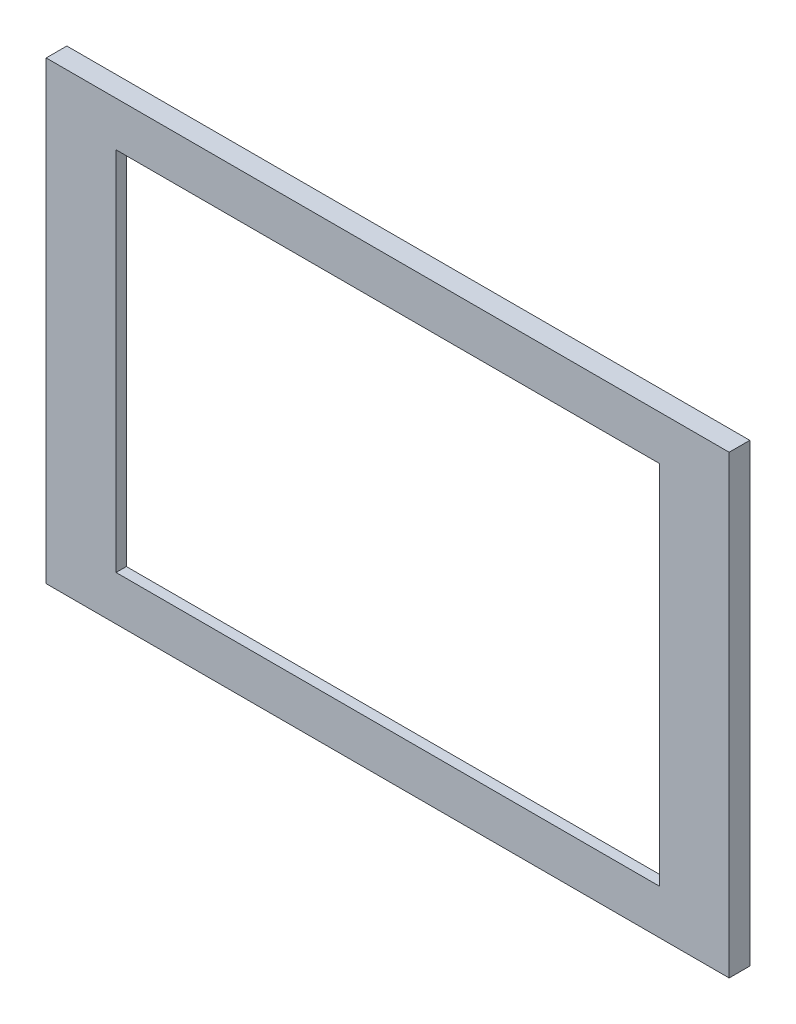
ISO-10303-21;
HEADER;
FILE_DESCRIPTION(('STEP AP214'),'2;1');
FILE_NAME('part.step','',(''),(''),'','','');
FILE_SCHEMA(('AUTOMOTIVE_DESIGN { 1 0 10303 214 1 1 1 1 }'));
ENDSEC;
DATA;
#1=APPLICATION_CONTEXT('core data for automotive mechanical design processes');
#2=APPLICATION_PROTOCOL_DEFINITION('international standard','automotive_design',2000,#1);
#3=PRODUCT_CONTEXT('',#1,'mechanical');
#4=PRODUCT('Part','Part','',(#3));
#5=PRODUCT_RELATED_PRODUCT_CATEGORY('part','',(#4));
#6=PRODUCT_DEFINITION_FORMATION('','',#4);
#7=PRODUCT_DEFINITION_CONTEXT('part definition',#1,'design');
#8=PRODUCT_DEFINITION('design','',#6,#7);
#9=PRODUCT_DEFINITION_SHAPE('','',#8);
#10=(LENGTH_UNIT() NAMED_UNIT(*) SI_UNIT(.MILLI.,.METRE.));
#11=(NAMED_UNIT(*) PLANE_ANGLE_UNIT() SI_UNIT($,.RADIAN.));
#12=(NAMED_UNIT(*) SI_UNIT($,.STERADIAN.) SOLID_ANGLE_UNIT());
#13=UNCERTAINTY_MEASURE_WITH_UNIT(LENGTH_MEASURE(1.E-05),#10,'distance_accuracy_value','');
#14=(GEOMETRIC_REPRESENTATION_CONTEXT(3) GLOBAL_UNCERTAINTY_ASSIGNED_CONTEXT((#13)) GLOBAL_UNIT_ASSIGNED_CONTEXT((#10,
#11,#12)) REPRESENTATION_CONTEXT('',''));
#15=CARTESIAN_POINT('',(0.,0.,0.));
#16=DIRECTION('',(0.,0.,1.));
#17=DIRECTION('',(1.,0.,0.));
#18=AXIS2_PLACEMENT_3D('',#15,#16,#17);
#19=CARTESIAN_POINT('',(0.,0.,3.175));
#20=DIRECTION('',(0.,0.,1.));
#21=DIRECTION('',(1.,0.,0.));
#22=AXIS2_PLACEMENT_3D('',#19,#20,#21);
#23=PLANE('',#22);
#24=DIRECTION('',(-1.,0.,0.));
#25=VECTOR('',#24,1.);
#26=CARTESIAN_POINT('',(-41.76,28.14,3.175));
#27=LINE('',#26,#25);
#28=CARTESIAN_POINT('',(41.76,28.14,3.175));
#29=VERTEX_POINT('',#28);
#30=CARTESIAN_POINT('',(-41.76,28.14,3.175));
#31=VERTEX_POINT('',#30);
#32=EDGE_CURVE('E231',#29,#31,#27,.T.);
#33=ORIENTED_EDGE('',*,*,#32,.F.);
#34=DIRECTION('',(0.,1.,0.));
#35=VECTOR('',#34,1.);
#36=CARTESIAN_POINT('',(41.76,-28.14,3.175));
#37=LINE('',#36,#35);
#38=CARTESIAN_POINT('',(41.76,-28.14,3.175));
#39=VERTEX_POINT('',#38);
#40=EDGE_CURVE('E219',#39,#29,#37,.T.);
#41=ORIENTED_EDGE('',*,*,#40,.F.);
#42=DIRECTION('',(1.,0.,0.));
#43=VECTOR('',#42,1.);
#44=CARTESIAN_POINT('',(-41.76,-28.14,3.175));
#45=LINE('',#44,#43);
#46=CARTESIAN_POINT('',(-41.76,-28.14,3.175));
#47=VERTEX_POINT('',#46);
#48=EDGE_CURVE('E238',#47,#39,#45,.T.);
#49=ORIENTED_EDGE('',*,*,#48,.F.);
#50=DIRECTION('',(0.,-1.,0.));
#51=VECTOR('',#50,1.);
#52=CARTESIAN_POINT('',(-41.76,-28.14,3.175));
#53=LINE('',#52,#51);
#54=EDGE_CURVE('E234',#31,#47,#53,.T.);
#55=ORIENTED_EDGE('',*,*,#54,.F.);
#56=EDGE_LOOP('',(#33,#41,#49,#55));
#57=FACE_BOUND('',#56,.T.);
#58=DIRECTION('',(1.,0.,0.));
#59=VECTOR('',#58,1.);
#60=CARTESIAN_POINT('',(-52.5,-35.,3.175));
#61=LINE('',#60,#59);
#62=CARTESIAN_POINT('',(-52.5,-35.,3.175));
#63=VERTEX_POINT('',#62);
#64=CARTESIAN_POINT('',(52.5,-35.,3.175));
#65=VERTEX_POINT('',#64);
#66=EDGE_CURVE('E145',#63,#65,#61,.T.);
#67=ORIENTED_EDGE('',*,*,#66,.T.);
#68=DIRECTION('',(0.,1.,0.));
#69=VECTOR('',#68,1.);
#70=CARTESIAN_POINT('',(52.5,35.,3.175));
#71=LINE('',#70,#69);
#72=CARTESIAN_POINT('',(52.5,35.,3.175));
#73=VERTEX_POINT('',#72);
#74=EDGE_CURVE('E158',#65,#73,#71,.T.);
#75=ORIENTED_EDGE('',*,*,#74,.T.);
#76=DIRECTION('',(-1.,0.,0.));
#77=VECTOR('',#76,1.);
#78=CARTESIAN_POINT('',(-52.5,35.,3.175));
#79=LINE('',#78,#77);
#80=CARTESIAN_POINT('',(-52.5,35.,3.175));
#81=VERTEX_POINT('',#80);
#82=EDGE_CURVE('E154',#73,#81,#79,.T.);
#83=ORIENTED_EDGE('',*,*,#82,.T.);
#84=DIRECTION('',(0.,-1.,0.));
#85=VECTOR('',#84,1.);
#86=CARTESIAN_POINT('',(-52.5,35.,3.175));
#87=LINE('',#86,#85);
#88=EDGE_CURVE('E61',#81,#63,#87,.T.);
#89=ORIENTED_EDGE('',*,*,#88,.T.);
#90=EDGE_LOOP('',(#67,#75,#83,#89));
#91=FACE_BOUND('',#90,.T.);
#92=ADVANCED_FACE('F45',(#57,#91),#23,.T.);
#93=CARTESIAN_POINT('',(0.,0.,0.));
#94=DIRECTION('',(0.,0.,1.));
#95=DIRECTION('',(1.,0.,0.));
#96=AXIS2_PLACEMENT_3D('',#93,#94,#95);
#97=PLANE('',#96);
#98=DIRECTION('',(1.,0.,0.));
#99=VECTOR('',#98,1.);
#100=CARTESIAN_POINT('',(47.385,30.54,0.));
#101=LINE('',#100,#99);
#102=CARTESIAN_POINT('',(-49.26,30.54,0.));
#103=VERTEX_POINT('',#102);
#104=CARTESIAN_POINT('',(47.385,30.54,0.));
#105=VERTEX_POINT('',#104);
#106=EDGE_CURVE('E205',#103,#105,#101,.T.);
#107=ORIENTED_EDGE('',*,*,#106,.F.);
#108=DIRECTION('',(0.,1.,0.));
#109=VECTOR('',#108,1.);
#110=CARTESIAN_POINT('',(-49.26,30.54,0.));
#111=LINE('',#110,#109);
#112=CARTESIAN_POINT('',(-49.26,-30.54,0.));
#113=VERTEX_POINT('',#112);
#114=EDGE_CURVE('E184',#113,#103,#111,.T.);
#115=ORIENTED_EDGE('',*,*,#114,.F.);
#116=DIRECTION('',(-1.,0.,0.));
#117=VECTOR('',#116,1.);
#118=CARTESIAN_POINT('',(47.385,-30.54,0.));
#119=LINE('',#118,#117);
#120=CARTESIAN_POINT('',(47.385,-30.54,0.));
#121=VERTEX_POINT('',#120);
#122=EDGE_CURVE('E190',#121,#113,#119,.T.);
#123=ORIENTED_EDGE('',*,*,#122,.F.);
#124=DIRECTION('',(0.,-1.,0.));
#125=VECTOR('',#124,1.);
#126=CARTESIAN_POINT('',(47.385,30.54,0.));
#127=LINE('',#126,#125);
#128=EDGE_CURVE('E209',#105,#121,#127,.T.);
#129=ORIENTED_EDGE('',*,*,#128,.F.);
#130=EDGE_LOOP('',(#107,#115,#123,#129));
#131=FACE_BOUND('',#130,.T.);
#132=DIRECTION('',(0.,1.,0.));
#133=VECTOR('',#132,1.);
#134=CARTESIAN_POINT('',(52.5,0.,0.));
#135=LINE('',#134,#133);
#136=CARTESIAN_POINT('',(52.5,-35.,0.));
#137=VERTEX_POINT('',#136);
#138=CARTESIAN_POINT('',(52.5,35.,0.));
#139=VERTEX_POINT('',#138);
#140=EDGE_CURVE('E11',#137,#139,#135,.T.);
#141=ORIENTED_EDGE('',*,*,#140,.F.);
#142=DIRECTION('',(1.,0.,0.));
#143=VECTOR('',#142,1.);
#144=CARTESIAN_POINT('',(0.,-35.,0.));
#145=LINE('',#144,#143);
#146=CARTESIAN_POINT('',(-52.5,-35.,0.));
#147=VERTEX_POINT('',#146);
#148=EDGE_CURVE('E54',#147,#137,#145,.T.);
#149=ORIENTED_EDGE('',*,*,#148,.F.);
#150=DIRECTION('',(0.,-1.,0.));
#151=VECTOR('',#150,1.);
#152=CARTESIAN_POINT('',(-52.5,0.,0.));
#153=LINE('',#152,#151);
#154=CARTESIAN_POINT('',(-52.5,35.,0.));
#155=VERTEX_POINT('',#154);
#156=EDGE_CURVE('E137',#155,#147,#153,.T.);
#157=ORIENTED_EDGE('',*,*,#156,.F.);
#158=DIRECTION('',(-1.,0.,0.));
#159=VECTOR('',#158,1.);
#160=CARTESIAN_POINT('',(0.,35.,0.));
#161=LINE('',#160,#159);
#162=EDGE_CURVE('E257',#139,#155,#161,.T.);
#163=ORIENTED_EDGE('',*,*,#162,.F.);
#164=EDGE_LOOP('',(#141,#149,#157,#163));
#165=FACE_BOUND('',#164,.T.);
#166=ADVANCED_FACE('F47',(#131,#165),#97,.F.);
#167=CARTESIAN_POINT('',(41.76,-28.14,3.175));
#168=DIRECTION('',(-1.,0.,0.));
#169=DIRECTION('',(0.,0.,1.));
#170=AXIS2_PLACEMENT_3D('',#167,#168,#169);
#171=PLANE('',#170);
#172=DIRECTION('',(0.,0.,-1.));
#173=VECTOR('',#172,1.);
#174=CARTESIAN_POINT('',(41.76,28.14,3.175));
#175=LINE('',#174,#173);
#176=CARTESIAN_POINT('',(41.76,28.14,1.5875));
#177=VERTEX_POINT('',#176);
#178=EDGE_CURVE('E253',#29,#177,#175,.T.);
#179=ORIENTED_EDGE('',*,*,#178,.T.);
#180=DIRECTION('',(0.,-1.,0.));
#181=VECTOR('',#180,1.);
#182=CARTESIAN_POINT('',(41.76,-28.14,1.5875));
#183=LINE('',#182,#181);
#184=CARTESIAN_POINT('',(41.76,-28.14,1.5875));
#185=VERTEX_POINT('',#184);
#186=EDGE_CURVE('E172',#177,#185,#183,.T.);
#187=ORIENTED_EDGE('',*,*,#186,.T.);
#188=DIRECTION('',(0.,0.,-1.));
#189=VECTOR('',#188,1.);
#190=CARTESIAN_POINT('',(41.76,-28.14,3.175));
#191=LINE('',#190,#189);
#192=EDGE_CURVE('E241',#39,#185,#191,.T.);
#193=ORIENTED_EDGE('',*,*,#192,.F.);
#194=ORIENTED_EDGE('',*,*,#40,.T.);
#195=EDGE_LOOP('',(#179,#187,#193,#194));
#196=FACE_BOUND('',#195,.T.);
#197=ADVANCED_FACE('F282',(#196),#171,.T.);
#198=CARTESIAN_POINT('',(-41.76,28.14,3.175));
#199=DIRECTION('',(0.,-1.,0.));
#200=DIRECTION('',(0.,0.,-1.));
#201=AXIS2_PLACEMENT_3D('',#198,#199,#200);
#202=PLANE('',#201);
#203=DIRECTION('',(0.,0.,-1.));
#204=VECTOR('',#203,1.);
#205=CARTESIAN_POINT('',(-41.76,28.14,3.175));
#206=LINE('',#205,#204);
#207=CARTESIAN_POINT('',(-41.76,28.14,1.5875));
#208=VERTEX_POINT('',#207);
#209=EDGE_CURVE('E249',#31,#208,#206,.T.);
#210=ORIENTED_EDGE('',*,*,#209,.T.);
#211=DIRECTION('',(1.,0.,0.));
#212=VECTOR('',#211,1.);
#213=CARTESIAN_POINT('',(41.76,28.14,1.5875));
#214=LINE('',#213,#212);
#215=EDGE_CURVE('E163',#208,#177,#214,.T.);
#216=ORIENTED_EDGE('',*,*,#215,.T.);
#217=ORIENTED_EDGE('',*,*,#178,.F.);
#218=ORIENTED_EDGE('',*,*,#32,.T.);
#219=EDGE_LOOP('',(#210,#216,#217,#218));
#220=FACE_BOUND('',#219,.T.);
#221=ADVANCED_FACE('F288',(#220),#202,.T.);
#222=CARTESIAN_POINT('',(-41.76,-28.14,3.175));
#223=DIRECTION('',(1.,0.,0.));
#224=DIRECTION('',(0.,0.,-1.));
#225=AXIS2_PLACEMENT_3D('',#222,#223,#224);
#226=PLANE('',#225);
#227=DIRECTION('',(0.,0.,-1.));
#228=VECTOR('',#227,1.);
#229=CARTESIAN_POINT('',(-41.76,-28.14,3.175));
#230=LINE('',#229,#228);
#231=CARTESIAN_POINT('',(-41.76,-28.14,1.5875));
#232=VERTEX_POINT('',#231);
#233=EDGE_CURVE('E245',#47,#232,#230,.T.);
#234=ORIENTED_EDGE('',*,*,#233,.T.);
#235=DIRECTION('',(0.,1.,0.));
#236=VECTOR('',#235,1.);
#237=CARTESIAN_POINT('',(-41.76,28.14,1.5875));
#238=LINE('',#237,#236);
#239=EDGE_CURVE('E180',#232,#208,#238,.T.);
#240=ORIENTED_EDGE('',*,*,#239,.T.);
#241=ORIENTED_EDGE('',*,*,#209,.F.);
#242=ORIENTED_EDGE('',*,*,#54,.T.);
#243=EDGE_LOOP('',(#234,#240,#241,#242));
#244=FACE_BOUND('',#243,.T.);
#245=ADVANCED_FACE('F292',(#244),#226,.T.);
#246=CARTESIAN_POINT('',(-41.76,-28.14,3.175));
#247=DIRECTION('',(0.,1.,0.));
#248=DIRECTION('',(0.,0.,1.));
#249=AXIS2_PLACEMENT_3D('',#246,#247,#248);
#250=PLANE('',#249);
#251=ORIENTED_EDGE('',*,*,#192,.T.);
#252=DIRECTION('',(-1.,0.,0.));
#253=VECTOR('',#252,1.);
#254=CARTESIAN_POINT('',(-41.76,-28.14,1.5875));
#255=LINE('',#254,#253);
#256=EDGE_CURVE('E176',#185,#232,#255,.T.);
#257=ORIENTED_EDGE('',*,*,#256,.T.);
#258=ORIENTED_EDGE('',*,*,#233,.F.);
#259=ORIENTED_EDGE('',*,*,#48,.T.);
#260=EDGE_LOOP('',(#251,#257,#258,#259));
#261=FACE_BOUND('',#260,.T.);
#262=ADVANCED_FACE('F296',(#261),#250,.T.);
#263=CARTESIAN_POINT('',(-49.26,30.54,1.5875));
#264=DIRECTION('',(-1.,0.,0.));
#265=DIRECTION('',(0.,0.,1.));
#266=AXIS2_PLACEMENT_3D('',#263,#264,#265);
#267=PLANE('',#266);
#268=ORIENTED_EDGE('',*,*,#114,.T.);
#269=DIRECTION('',(0.,0.,-1.));
#270=VECTOR('',#269,1.);
#271=CARTESIAN_POINT('',(-49.26,30.54,1.5875));
#272=LINE('',#271,#270);
#273=CARTESIAN_POINT('',(-49.26,30.54,1.5875));
#274=VERTEX_POINT('',#273);
#275=EDGE_CURVE('E202',#274,#103,#272,.T.);
#276=ORIENTED_EDGE('',*,*,#275,.F.);
#277=DIRECTION('',(0.,1.,0.));
#278=VECTOR('',#277,1.);
#279=CARTESIAN_POINT('',(-49.26,30.54,1.5875));
#280=LINE('',#279,#278);
#281=CARTESIAN_POINT('',(-49.26,-30.54,1.5875));
#282=VERTEX_POINT('',#281);
#283=EDGE_CURVE('E185',#282,#274,#280,.T.);
#284=ORIENTED_EDGE('',*,*,#283,.F.);
#285=DIRECTION('',(0.,0.,-1.));
#286=VECTOR('',#285,1.);
#287=CARTESIAN_POINT('',(-49.26,-30.54,1.5875));
#288=LINE('',#287,#286);
#289=EDGE_CURVE('E216',#282,#113,#288,.T.);
#290=ORIENTED_EDGE('',*,*,#289,.T.);
#291=EDGE_LOOP('',(#268,#276,#284,#290));
#292=FACE_BOUND('',#291,.T.);
#293=ADVANCED_FACE('F300',(#292),#267,.F.);
#294=CARTESIAN_POINT('',(47.385,-30.54,1.5875));
#295=DIRECTION('',(0.,-1.,0.));
#296=DIRECTION('',(1.,0.,0.));
#297=AXIS2_PLACEMENT_3D('',#294,#295,#296);
#298=PLANE('',#297);
#299=ORIENTED_EDGE('',*,*,#122,.T.);
#300=ORIENTED_EDGE('',*,*,#289,.F.);
#301=DIRECTION('',(-1.,0.,0.));
#302=VECTOR('',#301,1.);
#303=CARTESIAN_POINT('',(47.385,-30.54,1.5875));
#304=LINE('',#303,#302);
#305=CARTESIAN_POINT('',(47.385,-30.54,1.5875));
#306=VERTEX_POINT('',#305);
#307=EDGE_CURVE('E198',#306,#282,#304,.T.);
#308=ORIENTED_EDGE('',*,*,#307,.F.);
#309=DIRECTION('',(0.,0.,-1.));
#310=VECTOR('',#309,1.);
#311=CARTESIAN_POINT('',(47.385,-30.54,1.5875));
#312=LINE('',#311,#310);
#313=EDGE_CURVE('E220',#306,#121,#312,.T.);
#314=ORIENTED_EDGE('',*,*,#313,.T.);
#315=EDGE_LOOP('',(#299,#300,#308,#314));
#316=FACE_BOUND('',#315,.T.);
#317=ADVANCED_FACE('F304',(#316),#298,.F.);
#318=CARTESIAN_POINT('',(47.385,30.54,1.5875));
#319=DIRECTION('',(1.,0.,0.));
#320=DIRECTION('',(0.,1.,0.));
#321=AXIS2_PLACEMENT_3D('',#318,#319,#320);
#322=PLANE('',#321);
#323=ORIENTED_EDGE('',*,*,#128,.T.);
#324=ORIENTED_EDGE('',*,*,#313,.F.);
#325=DIRECTION('',(0.,-1.,0.));
#326=VECTOR('',#325,1.);
#327=CARTESIAN_POINT('',(47.385,30.54,1.5875));
#328=LINE('',#327,#326);
#329=CARTESIAN_POINT('',(47.385,30.54,1.5875));
#330=VERTEX_POINT('',#329);
#331=EDGE_CURVE('E194',#330,#306,#328,.T.);
#332=ORIENTED_EDGE('',*,*,#331,.F.);
#333=DIRECTION('',(0.,0.,-1.));
#334=VECTOR('',#333,1.);
#335=CARTESIAN_POINT('',(47.385,30.54,1.5875));
#336=LINE('',#335,#334);
#337=EDGE_CURVE('E223',#330,#105,#336,.T.);
#338=ORIENTED_EDGE('',*,*,#337,.T.);
#339=EDGE_LOOP('',(#323,#324,#332,#338));
#340=FACE_BOUND('',#339,.T.);
#341=ADVANCED_FACE('F310',(#340),#322,.F.);
#342=CARTESIAN_POINT('',(47.385,30.54,1.5875));
#343=DIRECTION('',(0.,1.,0.));
#344=DIRECTION('',(-1.,0.,0.));
#345=AXIS2_PLACEMENT_3D('',#342,#343,#344);
#346=PLANE('',#345);
#347=ORIENTED_EDGE('',*,*,#106,.T.);
#348=ORIENTED_EDGE('',*,*,#337,.F.);
#349=DIRECTION('',(1.,0.,0.));
#350=VECTOR('',#349,1.);
#351=CARTESIAN_POINT('',(47.385,30.54,1.5875));
#352=LINE('',#351,#350);
#353=EDGE_CURVE('E189',#274,#330,#352,.T.);
#354=ORIENTED_EDGE('',*,*,#353,.F.);
#355=ORIENTED_EDGE('',*,*,#275,.T.);
#356=EDGE_LOOP('',(#347,#348,#354,#355));
#357=FACE_BOUND('',#356,.T.);
#358=ADVANCED_FACE('F306',(#357),#346,.F.);
#359=CARTESIAN_POINT('',(0.,0.,1.5875));
#360=DIRECTION('',(0.,0.,-1.));
#361=DIRECTION('',(-1.,0.,0.));
#362=AXIS2_PLACEMENT_3D('',#359,#360,#361);
#363=PLANE('',#362);
#364=ORIENTED_EDGE('',*,*,#239,.F.);
#365=ORIENTED_EDGE('',*,*,#256,.F.);
#366=ORIENTED_EDGE('',*,*,#186,.F.);
#367=ORIENTED_EDGE('',*,*,#215,.F.);
#368=EDGE_LOOP('',(#364,#365,#366,#367));
#369=FACE_BOUND('',#368,.T.);
#370=ORIENTED_EDGE('',*,*,#283,.T.);
#371=ORIENTED_EDGE('',*,*,#353,.T.);
#372=ORIENTED_EDGE('',*,*,#331,.T.);
#373=ORIENTED_EDGE('',*,*,#307,.T.);
#374=EDGE_LOOP('',(#370,#371,#372,#373));
#375=FACE_BOUND('',#374,.T.);
#376=ADVANCED_FACE('F309',(#369,#375),#363,.T.);
#377=CARTESIAN_POINT('',(52.5,35.,-6.825));
#378=DIRECTION('',(1.,0.,0.));
#379=DIRECTION('',(0.,1.,0.));
#380=AXIS2_PLACEMENT_3D('',#377,#378,#379);
#381=PLANE('',#380);
#382=ORIENTED_EDGE('',*,*,#140,.T.);
#383=DIRECTION('',(0.,0.,1.));
#384=VECTOR('',#383,1.);
#385=CARTESIAN_POINT('',(52.5,35.,-6.825));
#386=LINE('',#385,#384);
#387=EDGE_CURVE('E69',#139,#73,#386,.T.);
#388=ORIENTED_EDGE('',*,*,#387,.T.);
#389=ORIENTED_EDGE('',*,*,#74,.F.);
#390=DIRECTION('',(0.,0.,1.));
#391=VECTOR('',#390,1.);
#392=CARTESIAN_POINT('',(52.5,-35.,-6.825));
#393=LINE('',#392,#391);
#394=EDGE_CURVE('E141',#137,#65,#393,.T.);
#395=ORIENTED_EDGE('',*,*,#394,.F.);
#396=EDGE_LOOP('',(#382,#388,#389,#395));
#397=FACE_BOUND('',#396,.T.);
#398=ADVANCED_FACE('F265',(#397),#381,.T.);
#399=CARTESIAN_POINT('',(-52.5,-35.,-6.825));
#400=DIRECTION('',(0.,-1.,0.));
#401=DIRECTION('',(0.,0.,-1.));
#402=AXIS2_PLACEMENT_3D('',#399,#400,#401);
#403=PLANE('',#402);
#404=ORIENTED_EDGE('',*,*,#148,.T.);
#405=ORIENTED_EDGE('',*,*,#394,.T.);
#406=ORIENTED_EDGE('',*,*,#66,.F.);
#407=DIRECTION('',(0.,0.,1.));
#408=VECTOR('',#407,1.);
#409=CARTESIAN_POINT('',(-52.5,-35.,-6.825));
#410=LINE('',#409,#408);
#411=EDGE_CURVE('E133',#147,#63,#410,.T.);
#412=ORIENTED_EDGE('',*,*,#411,.F.);
#413=EDGE_LOOP('',(#404,#405,#406,#412));
#414=FACE_BOUND('',#413,.T.);
#415=ADVANCED_FACE('F146',(#414),#403,.T.);
#416=CARTESIAN_POINT('',(-52.5,35.,-6.825));
#417=DIRECTION('',(-1.,0.,0.));
#418=DIRECTION('',(0.,-1.,0.));
#419=AXIS2_PLACEMENT_3D('',#416,#417,#418);
#420=PLANE('',#419);
#421=ORIENTED_EDGE('',*,*,#156,.T.);
#422=ORIENTED_EDGE('',*,*,#411,.T.);
#423=ORIENTED_EDGE('',*,*,#88,.F.);
#424=DIRECTION('',(0.,0.,1.));
#425=VECTOR('',#424,1.);
#426=CARTESIAN_POINT('',(-52.5,35.,-6.825));
#427=LINE('',#426,#425);
#428=EDGE_CURVE('E142',#155,#81,#427,.T.);
#429=ORIENTED_EDGE('',*,*,#428,.F.);
#430=EDGE_LOOP('',(#421,#422,#423,#429));
#431=FACE_BOUND('',#430,.T.);
#432=ADVANCED_FACE('F135',(#431),#420,.T.);
#433=CARTESIAN_POINT('',(-52.5,35.,-6.825));
#434=DIRECTION('',(0.,1.,0.));
#435=DIRECTION('',(0.,0.,1.));
#436=AXIS2_PLACEMENT_3D('',#433,#434,#435);
#437=PLANE('',#436);
#438=ORIENTED_EDGE('',*,*,#162,.T.);
#439=ORIENTED_EDGE('',*,*,#428,.T.);
#440=ORIENTED_EDGE('',*,*,#82,.F.);
#441=ORIENTED_EDGE('',*,*,#387,.F.);
#442=EDGE_LOOP('',(#438,#439,#440,#441));
#443=FACE_BOUND('',#442,.T.);
#444=ADVANCED_FACE('F267',(#443),#437,.T.);
#445=CLOSED_SHELL('',(#92,#166,#197,#221,#245,#262,#293,#317,#341,#358,#376,#398,#415,#432,#444));
#446=MANIFOLD_SOLID_BREP('B2',#445);
#447=ADVANCED_BREP_SHAPE_REPRESENTATION('',(#18,#446),#14);
#448=SHAPE_DEFINITION_REPRESENTATION(#9,#447);
ENDSEC;
END-ISO-10303-21;
